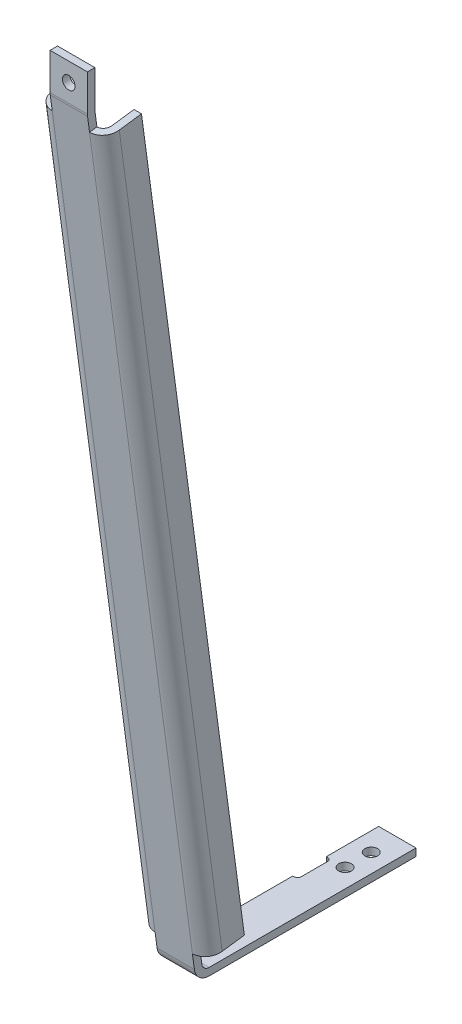
ISO-10303-21;
HEADER;
FILE_DESCRIPTION(('STEP AP214'),'2;1');
FILE_NAME('part.step','',(''),(''),'','','');
FILE_SCHEMA(('AUTOMOTIVE_DESIGN { 1 0 10303 214 1 1 1 1 }'));
ENDSEC;
DATA;
#1=APPLICATION_CONTEXT('core data for automotive mechanical design processes');
#2=APPLICATION_PROTOCOL_DEFINITION('international standard','automotive_design',2000,#1);
#3=PRODUCT_CONTEXT('',#1,'mechanical');
#4=PRODUCT('Part','Part','',(#3));
#5=PRODUCT_RELATED_PRODUCT_CATEGORY('part','',(#4));
#6=PRODUCT_DEFINITION_FORMATION('','',#4);
#7=PRODUCT_DEFINITION_CONTEXT('part definition',#1,'design');
#8=PRODUCT_DEFINITION('design','',#6,#7);
#9=PRODUCT_DEFINITION_SHAPE('','',#8);
#10=(LENGTH_UNIT() NAMED_UNIT(*) SI_UNIT(.MILLI.,.METRE.));
#11=(NAMED_UNIT(*) PLANE_ANGLE_UNIT() SI_UNIT($,.RADIAN.));
#12=(NAMED_UNIT(*) SI_UNIT($,.STERADIAN.) SOLID_ANGLE_UNIT());
#13=UNCERTAINTY_MEASURE_WITH_UNIT(LENGTH_MEASURE(1.E-05),#10,'distance_accuracy_value','');
#14=(GEOMETRIC_REPRESENTATION_CONTEXT(3) GLOBAL_UNCERTAINTY_ASSIGNED_CONTEXT((#13)) GLOBAL_UNIT_ASSIGNED_CONTEXT((#10,
#11,#12)) REPRESENTATION_CONTEXT('',''));
#15=CARTESIAN_POINT('',(0.,0.,0.));
#16=DIRECTION('',(0.,0.,1.));
#17=DIRECTION('',(1.,0.,0.));
#18=AXIS2_PLACEMENT_3D('',#15,#16,#17);
#19=CARTESIAN_POINT('',(-30.,68.,77.3774837469467));
#20=DIRECTION('',(1.,0.,0.));
#21=DIRECTION('',(0.,0.,-1.));
#22=AXIS2_PLACEMENT_3D('',#19,#20,#21);
#23=PLANE('',#22);
#24=DIRECTION('',(0.,0.,1.));
#25=VECTOR('',#24,1.);
#26=CARTESIAN_POINT('',(-30.,66.,77.3774837469467));
#27=LINE('',#26,#25);
#28=CARTESIAN_POINT('',(-30.,66.,45.));
#29=VERTEX_POINT('',#28);
#30=CARTESIAN_POINT('',(-30.,66.,77.3774837469467));
#31=VERTEX_POINT('',#30);
#32=EDGE_CURVE('E481',#29,#31,#27,.T.);
#33=ORIENTED_EDGE('',*,*,#32,.F.);
#34=DIRECTION('',(0.,-1.,0.));
#35=VECTOR('',#34,1.);
#36=CARTESIAN_POINT('',(-30.,68.,45.));
#37=LINE('',#36,#35);
#38=CARTESIAN_POINT('',(-30.,64.,45.));
#39=VERTEX_POINT('',#38);
#40=EDGE_CURVE('E244',#29,#39,#37,.T.);
#41=ORIENTED_EDGE('',*,*,#40,.T.);
#42=DIRECTION('',(0.,0.,-1.));
#43=VECTOR('',#42,1.);
#44=CARTESIAN_POINT('',(-30.,64.,22.));
#45=LINE('',#44,#43);
#46=CARTESIAN_POINT('',(-30.,64.,77.3774837469467));
#47=VERTEX_POINT('',#46);
#48=EDGE_CURVE('E265',#47,#39,#45,.T.);
#49=ORIENTED_EDGE('',*,*,#48,.F.);
#50=CARTESIAN_POINT('',(-30.,68.,77.3774837469467));
#51=DIRECTION('',(1.,0.,0.));
#52=DIRECTION('',(0.,0.,-1.));
#53=AXIS2_PLACEMENT_3D('',#50,#51,#52);
#54=CIRCLE('',#53,4.00000000000001);
#55=CARTESIAN_POINT('',(-30.,67.4653071902495,81.3415856123383));
#56=VERTEX_POINT('',#55);
#57=EDGE_CURVE('E263',#56,#47,#54,.T.);
#58=ORIENTED_EDGE('',*,*,#57,.F.);
#59=DIRECTION('',(0.,-0.991025466347899,-0.133673202437623));
#60=VECTOR('',#59,1.);
#61=CARTESIAN_POINT('',(-30.,67.4653071902495,81.3415856123383));
#62=LINE('',#61,#60);
#63=CARTESIAN_POINT('',(-30.,71.4294090556411,81.8762784220888));
#64=VERTEX_POINT('',#63);
#65=EDGE_CURVE('E496',#64,#56,#62,.T.);
#66=ORIENTED_EDGE('',*,*,#65,.F.);
#67=DIRECTION('',(0.,0.133673202437623,-0.991025466347899));
#68=VECTOR('',#67,1.);
#69=CARTESIAN_POINT('',(-30.,71.9641018653916,77.9121765566972));
#70=LINE('',#69,#68);
#71=CARTESIAN_POINT('',(-30.,71.6967554605163,79.894227489393));
#72=VERTEX_POINT('',#71);
#73=EDGE_CURVE('E308',#64,#72,#70,.T.);
#74=ORIENTED_EDGE('',*,*,#73,.T.);
#75=DIRECTION('',(0.,0.991025466347899,0.133673202437624));
#76=VECTOR('',#75,1.);
#77=CARTESIAN_POINT('',(-30.,279.934067195348,107.982050932696));
#78=LINE('',#77,#76);
#79=CARTESIAN_POINT('',(-30.,67.7326535951247,79.3595346796425));
#80=VERTEX_POINT('',#79);
#81=EDGE_CURVE('E490',#80,#72,#78,.T.);
#82=ORIENTED_EDGE('',*,*,#81,.F.);
#83=CARTESIAN_POINT('',(-30.,68.,77.3774837469467));
#84=DIRECTION('',(-1.,0.,0.));
#85=DIRECTION('',(0.,0.,-1.));
#86=AXIS2_PLACEMENT_3D('',#83,#84,#85);
#87=CIRCLE('',#86,2.);
#88=EDGE_CURVE('E482',#31,#80,#87,.T.);
#89=ORIENTED_EDGE('',*,*,#88,.F.);
#90=EDGE_LOOP('',(#33,#41,#49,#58,#66,#74,#82,#89));
#91=FACE_BOUND('',#90,.T.);
#92=ADVANCED_FACE('F41',(#91),#23,.F.);
#93=CARTESIAN_POINT('',(-20.,68.,77.3774837469467));
#94=DIRECTION('',(1.,0.,0.));
#95=DIRECTION('',(0.,0.,-1.));
#96=AXIS2_PLACEMENT_3D('',#93,#94,#95);
#97=PLANE('',#96);
#98=DIRECTION('',(0.,-0.991025466347899,-0.133673202437623));
#99=VECTOR('',#98,1.);
#100=CARTESIAN_POINT('',(-20.,67.4653071902495,81.3415856123383));
#101=LINE('',#100,#99);
#102=CARTESIAN_POINT('',(-20.,279.666720790473,109.964101865392));
#103=VERTEX_POINT('',#102);
#104=CARTESIAN_POINT('',(-20.,275.702618925081,109.429409055641));
#105=VERTEX_POINT('',#104);
#106=EDGE_CURVE('E475',#103,#105,#101,.T.);
#107=ORIENTED_EDGE('',*,*,#106,.T.);
#108=DIRECTION('',(0.,0.133673202437623,-0.991025466347899));
#109=VECTOR('',#108,1.);
#110=CARTESIAN_POINT('',(-20.,276.237311734832,105.465307190249));
#111=LINE('',#110,#109);
#112=CARTESIAN_POINT('',(-20.,275.969965329956,107.447358122945));
#113=VERTEX_POINT('',#112);
#114=EDGE_CURVE('E242',#105,#113,#111,.T.);
#115=ORIENTED_EDGE('',*,*,#114,.T.);
#116=DIRECTION('',(0.,0.991025466347899,0.133673202437624));
#117=VECTOR('',#116,1.);
#118=CARTESIAN_POINT('',(-20.,279.934067195348,107.982050932696));
#119=LINE('',#118,#117);
#120=CARTESIAN_POINT('',(-20.,279.934067195348,107.982050932696));
#121=VERTEX_POINT('',#120);
#122=EDGE_CURVE('E458',#113,#121,#119,.T.);
#123=ORIENTED_EDGE('',*,*,#122,.T.);
#124=CARTESIAN_POINT('',(-20.,280.201413600223,106.));
#125=DIRECTION('',(-1.,0.,0.));
#126=DIRECTION('',(0.,0.,-1.));
#127=AXIS2_PLACEMENT_3D('',#124,#125,#126);
#128=CIRCLE('',#127,2.00000000000001);
#129=CARTESIAN_POINT('',(-20.,280.201413600223,108.));
#130=VERTEX_POINT('',#129);
#131=EDGE_CURVE('E461',#121,#130,#128,.T.);
#132=ORIENTED_EDGE('',*,*,#131,.T.);
#133=DIRECTION('',(0.,1.,0.));
#134=VECTOR('',#133,1.);
#135=CARTESIAN_POINT('',(-20.,290.,108.));
#136=LINE('',#135,#134);
#137=CARTESIAN_POINT('',(-20.,290.,108.));
#138=VERTEX_POINT('',#137);
#139=EDGE_CURVE('E462',#130,#138,#136,.T.);
#140=ORIENTED_EDGE('',*,*,#139,.T.);
#141=DIRECTION('',(0.,0.,1.));
#142=VECTOR('',#141,1.);
#143=CARTESIAN_POINT('',(-20.,290.,110.));
#144=LINE('',#143,#142);
#145=CARTESIAN_POINT('',(-20.,290.,110.));
#146=VERTEX_POINT('',#145);
#147=EDGE_CURVE('E469',#138,#146,#144,.T.);
#148=ORIENTED_EDGE('',*,*,#147,.T.);
#149=DIRECTION('',(0.,-1.,0.));
#150=VECTOR('',#149,1.);
#151=CARTESIAN_POINT('',(-20.,280.201413600223,110.));
#152=LINE('',#151,#150);
#153=CARTESIAN_POINT('',(-20.,280.201413600223,110.));
#154=VERTEX_POINT('',#153);
#155=EDGE_CURVE('E466',#146,#154,#152,.T.);
#156=ORIENTED_EDGE('',*,*,#155,.T.);
#157=CARTESIAN_POINT('',(-20.,280.201413600223,106.));
#158=DIRECTION('',(1.,0.,0.));
#159=DIRECTION('',(0.,0.,-1.));
#160=AXIS2_PLACEMENT_3D('',#157,#158,#159);
#161=CIRCLE('',#160,3.99999999999999);
#162=EDGE_CURVE('E473',#154,#103,#161,.T.);
#163=ORIENTED_EDGE('',*,*,#162,.T.);
#164=EDGE_LOOP('',(#107,#115,#123,#132,#140,#148,#156,#163));
#165=FACE_BOUND('',#164,.T.);
#166=ADVANCED_FACE('F537',(#165),#97,.T.);
#167=DIRECTION('',(0.,0.133673202437623,-0.991025466347899));
#168=VECTOR('',#167,1.);
#169=CARTESIAN_POINT('',(-30.,276.237311734832,105.465307190249));
#170=LINE('',#169,#168);
#171=CARTESIAN_POINT('',(-30.,275.702618925081,109.429409055641));
#172=VERTEX_POINT('',#171);
#173=CARTESIAN_POINT('',(-30.,275.969965329956,107.447358122945));
#174=VERTEX_POINT('',#173);
#175=EDGE_CURVE('E310',#172,#174,#170,.T.);
#176=ORIENTED_EDGE('',*,*,#175,.F.);
#177=CARTESIAN_POINT('',(-30.,279.666720790473,109.964101865392));
#178=VERTEX_POINT('',#177);
#179=EDGE_CURVE('E266',#178,#172,#62,.T.);
#180=ORIENTED_EDGE('',*,*,#179,.F.);
#181=CARTESIAN_POINT('',(-30.,280.201413600223,106.));
#182=DIRECTION('',(1.,0.,0.));
#183=DIRECTION('',(0.,0.,-1.));
#184=AXIS2_PLACEMENT_3D('',#181,#182,#183);
#185=CIRCLE('',#184,3.99999999999999);
#186=CARTESIAN_POINT('',(-30.,280.201413600223,110.));
#187=VERTEX_POINT('',#186);
#188=EDGE_CURVE('E499',#187,#178,#185,.T.);
#189=ORIENTED_EDGE('',*,*,#188,.F.);
#190=DIRECTION('',(0.,-1.,0.));
#191=VECTOR('',#190,1.);
#192=CARTESIAN_POINT('',(-30.,280.201413600223,110.));
#193=LINE('',#192,#191);
#194=CARTESIAN_POINT('',(-30.,290.,110.));
#195=VERTEX_POINT('',#194);
#196=EDGE_CURVE('E497',#195,#187,#193,.T.);
#197=ORIENTED_EDGE('',*,*,#196,.F.);
#198=DIRECTION('',(0.,0.,1.));
#199=VECTOR('',#198,1.);
#200=CARTESIAN_POINT('',(-30.,290.,110.));
#201=LINE('',#200,#199);
#202=CARTESIAN_POINT('',(-30.,290.,108.));
#203=VERTEX_POINT('',#202);
#204=EDGE_CURVE('E493',#203,#195,#201,.T.);
#205=ORIENTED_EDGE('',*,*,#204,.F.);
#206=DIRECTION('',(0.,1.,0.));
#207=VECTOR('',#206,1.);
#208=CARTESIAN_POINT('',(-30.,290.,108.));
#209=LINE('',#208,#207);
#210=CARTESIAN_POINT('',(-30.,280.201413600223,108.));
#211=VERTEX_POINT('',#210);
#212=EDGE_CURVE('E495',#211,#203,#209,.T.);
#213=ORIENTED_EDGE('',*,*,#212,.F.);
#214=CARTESIAN_POINT('',(-30.,280.201413600223,106.));
#215=DIRECTION('',(-1.,0.,0.));
#216=DIRECTION('',(0.,0.,-1.));
#217=AXIS2_PLACEMENT_3D('',#214,#215,#216);
#218=CIRCLE('',#217,2.00000000000001);
#219=CARTESIAN_POINT('',(-30.,279.934067195348,107.982050932696));
#220=VERTEX_POINT('',#219);
#221=EDGE_CURVE('E489',#220,#211,#218,.T.);
#222=ORIENTED_EDGE('',*,*,#221,.F.);
#223=EDGE_CURVE('E486',#174,#220,#78,.T.);
#224=ORIENTED_EDGE('',*,*,#223,.F.);
#225=EDGE_LOOP('',(#176,#180,#189,#197,#205,#213,#222,#224));
#226=FACE_BOUND('',#225,.T.);
#227=ADVANCED_FACE('F565',(#226),#23,.F.);
#228=CARTESIAN_POINT('',(-20.,66.,22.));
#229=DIRECTION('',(0.,0.,1.));
#230=DIRECTION('',(1.,0.,0.));
#231=AXIS2_PLACEMENT_3D('',#228,#229,#230);
#232=PLANE('',#231);
#233=DIRECTION('',(0.,1.,0.));
#234=VECTOR('',#233,1.);
#235=CARTESIAN_POINT('',(-30.,66.,22.));
#236=LINE('',#235,#234);
#237=CARTESIAN_POINT('',(-30.,64.,22.));
#238=VERTEX_POINT('',#237);
#239=CARTESIAN_POINT('',(-30.,66.,22.));
#240=VERTEX_POINT('',#239);
#241=EDGE_CURVE('E261',#238,#240,#236,.T.);
#242=ORIENTED_EDGE('',*,*,#241,.T.);
#243=DIRECTION('',(-1.,0.,0.));
#244=VECTOR('',#243,1.);
#245=CARTESIAN_POINT('',(-20.,66.,22.));
#246=LINE('',#245,#244);
#247=CARTESIAN_POINT('',(-20.,66.,22.));
#248=VERTEX_POINT('',#247);
#249=EDGE_CURVE('E305',#248,#240,#246,.T.);
#250=ORIENTED_EDGE('',*,*,#249,.F.);
#251=DIRECTION('',(0.,1.,0.));
#252=VECTOR('',#251,1.);
#253=CARTESIAN_POINT('',(-20.,66.,22.));
#254=LINE('',#253,#252);
#255=CARTESIAN_POINT('',(-20.,64.,22.));
#256=VERTEX_POINT('',#255);
#257=EDGE_CURVE('E264',#256,#248,#254,.T.);
#258=ORIENTED_EDGE('',*,*,#257,.F.);
#259=DIRECTION('',(-1.,0.,0.));
#260=VECTOR('',#259,1.);
#261=CARTESIAN_POINT('',(-20.,64.,22.));
#262=LINE('',#261,#260);
#263=EDGE_CURVE('E269',#256,#238,#262,.T.);
#264=ORIENTED_EDGE('',*,*,#263,.T.);
#265=EDGE_LOOP('',(#242,#250,#258,#264));
#266=FACE_BOUND('',#265,.T.);
#267=ADVANCED_FACE('F43',(#266),#232,.F.);
#268=CARTESIAN_POINT('',(-20.,66.,77.3774837469467));
#269=DIRECTION('',(0.,-1.,0.));
#270=DIRECTION('',(0.,0.,-1.));
#271=AXIS2_PLACEMENT_3D('',#268,#269,#270);
#272=PLANE('',#271);
#273=CARTESIAN_POINT('',(-25.,66.,29.));
#274=DIRECTION('',(0.,-1.,0.));
#275=DIRECTION('',(0.,0.,-1.));
#276=AXIS2_PLACEMENT_3D('',#273,#274,#275);
#277=CIRCLE('',#276,1.7);
#278=CARTESIAN_POINT('',(-25.,66.,27.3));
#279=VERTEX_POINT('',#278);
#280=EDGE_CURVE('E321',#279,#279,#277,.T.);
#281=ORIENTED_EDGE('',*,*,#280,.T.);
#282=EDGE_LOOP('',(#281));
#283=FACE_BOUND('',#282,.T.);
#284=CARTESIAN_POINT('',(-25.,66.,36.));
#285=DIRECTION('',(0.,-1.,0.));
#286=DIRECTION('',(0.,0.,-1.));
#287=AXIS2_PLACEMENT_3D('',#284,#285,#286);
#288=CIRCLE('',#287,1.7);
#289=CARTESIAN_POINT('',(-25.,66.,34.3));
#290=VERTEX_POINT('',#289);
#291=EDGE_CURVE('E316',#290,#290,#288,.T.);
#292=ORIENTED_EDGE('',*,*,#291,.T.);
#293=EDGE_LOOP('',(#292));
#294=FACE_BOUND('',#293,.T.);
#295=CARTESIAN_POINT('',(-29.7,66.,44.));
#296=DIRECTION('',(0.,-1.,0.));
#297=DIRECTION('',(0.,0.,-1.));
#298=AXIS2_PLACEMENT_3D('',#295,#296,#297);
#299=CIRCLE('',#298,1.);
#300=CARTESIAN_POINT('',(-28.7,66.,44.));
#301=VERTEX_POINT('',#300);
#302=CARTESIAN_POINT('',(-29.7,66.,45.));
#303=VERTEX_POINT('',#302);
#304=EDGE_CURVE('E322',#301,#303,#299,.T.);
#305=ORIENTED_EDGE('',*,*,#304,.T.);
#306=DIRECTION('',(-1.,0.,0.));
#307=VECTOR('',#306,1.);
#308=CARTESIAN_POINT('',(-20.,66.,45.));
#309=LINE('',#308,#307);
#310=EDGE_CURVE('E355',#303,#29,#309,.T.);
#311=ORIENTED_EDGE('',*,*,#310,.T.);
#312=ORIENTED_EDGE('',*,*,#32,.T.);
#313=DIRECTION('',(-1.,0.,0.));
#314=VECTOR('',#313,1.);
#315=CARTESIAN_POINT('',(-20.,66.,77.3774837469467));
#316=LINE('',#315,#314);
#317=CARTESIAN_POINT('',(-20.,66.,77.3774837469467));
#318=VERTEX_POINT('',#317);
#319=EDGE_CURVE('E297',#318,#31,#316,.T.);
#320=ORIENTED_EDGE('',*,*,#319,.F.);
#321=DIRECTION('',(0.,0.,1.));
#322=VECTOR('',#321,1.);
#323=CARTESIAN_POINT('',(-20.,66.,77.3774837469467));
#324=LINE('',#323,#322);
#325=EDGE_CURVE('E457',#248,#318,#324,.T.);
#326=ORIENTED_EDGE('',*,*,#325,.F.);
#327=ORIENTED_EDGE('',*,*,#249,.T.);
#328=CARTESIAN_POINT('',(-30.,66.,36.));
#329=VERTEX_POINT('',#328);
#330=EDGE_CURVE('E485',#240,#329,#27,.T.);
#331=ORIENTED_EDGE('',*,*,#330,.T.);
#332=DIRECTION('',(1.,0.,0.));
#333=VECTOR('',#332,1.);
#334=CARTESIAN_POINT('',(-20.,66.,36.));
#335=LINE('',#334,#333);
#336=CARTESIAN_POINT('',(-29.7,66.,36.));
#337=VERTEX_POINT('',#336);
#338=EDGE_CURVE('E57',#329,#337,#335,.T.);
#339=ORIENTED_EDGE('',*,*,#338,.T.);
#340=CARTESIAN_POINT('',(-29.7,66.,37.));
#341=DIRECTION('',(0.,-1.,0.));
#342=DIRECTION('',(0.,0.,-1.));
#343=AXIS2_PLACEMENT_3D('',#340,#341,#342);
#344=CIRCLE('',#343,0.999999999999997);
#345=CARTESIAN_POINT('',(-28.7,66.,37.));
#346=VERTEX_POINT('',#345);
#347=EDGE_CURVE('E352',#337,#346,#344,.T.);
#348=ORIENTED_EDGE('',*,*,#347,.T.);
#349=DIRECTION('',(0.,0.,1.));
#350=VECTOR('',#349,1.);
#351=CARTESIAN_POINT('',(-28.7,66.,77.3774837469467));
#352=LINE('',#351,#350);
#353=EDGE_CURVE('E360',#346,#301,#352,.T.);
#354=ORIENTED_EDGE('',*,*,#353,.T.);
#355=EDGE_LOOP('',(#305,#311,#312,#320,#326,#327,#331,#339,#348,#354));
#356=FACE_BOUND('',#355,.T.);
#357=ADVANCED_FACE('F716',(#283,#294,#356),#272,.F.);
#358=CARTESIAN_POINT('',(-20.,68.,77.3774837469467));
#359=DIRECTION('',(-1.,0.,0.));
#360=DIRECTION('',(0.,0.,1.));
#361=AXIS2_PLACEMENT_3D('',#358,#359,#360);
#362=CYLINDRICAL_SURFACE('',#361,2.);
#363=ORIENTED_EDGE('',*,*,#88,.T.);
#364=DIRECTION('',(-1.,0.,0.));
#365=VECTOR('',#364,1.);
#366=CARTESIAN_POINT('',(-20.,67.7326535951247,79.3595346796425));
#367=LINE('',#366,#365);
#368=CARTESIAN_POINT('',(-20.,67.7326535951247,79.3595346796425));
#369=VERTEX_POINT('',#368);
#370=EDGE_CURVE('E300',#369,#80,#367,.T.);
#371=ORIENTED_EDGE('',*,*,#370,.F.);
#372=CARTESIAN_POINT('',(-20.,68.,77.3774837469467));
#373=DIRECTION('',(-1.,0.,0.));
#374=DIRECTION('',(0.,0.,-1.));
#375=AXIS2_PLACEMENT_3D('',#372,#373,#374);
#376=CIRCLE('',#375,2.);
#377=EDGE_CURVE('E456',#318,#369,#376,.T.);
#378=ORIENTED_EDGE('',*,*,#377,.F.);
#379=ORIENTED_EDGE('',*,*,#319,.T.);
#380=EDGE_LOOP('',(#363,#371,#378,#379));
#381=FACE_BOUND('',#380,.T.);
#382=ADVANCED_FACE('F727',(#381),#362,.F.);
#383=CARTESIAN_POINT('',(-20.,279.934067195348,107.982050932696));
#384=DIRECTION('',(0.,-0.133673202437624,0.991025466347899));
#385=DIRECTION('',(0.,-0.991025466347899,-0.133673202437624));
#386=AXIS2_PLACEMENT_3D('',#383,#384,#385);
#387=PLANE('',#386);
#388=ORIENTED_EDGE('',*,*,#122,.F.);
#389=DIRECTION('',(0.,-0.991025466347899,-0.133673202437623));
#390=VECTOR('',#389,1.);
#391=CARTESIAN_POINT('',(-20.,275.969965329956,107.447358122945));
#392=LINE('',#391,#390);
#393=CARTESIAN_POINT('',(-20.,71.6967554605164,79.894227489393));
#394=VERTEX_POINT('',#393);
#395=EDGE_CURVE('E418',#113,#394,#392,.T.);
#396=ORIENTED_EDGE('',*,*,#395,.T.);
#397=EDGE_CURVE('E463',#369,#394,#119,.T.);
#398=ORIENTED_EDGE('',*,*,#397,.F.);
#399=ORIENTED_EDGE('',*,*,#370,.T.);
#400=ORIENTED_EDGE('',*,*,#81,.T.);
#401=DIRECTION('',(0.,-0.991025466347899,-0.133673202437623));
#402=VECTOR('',#401,1.);
#403=CARTESIAN_POINT('',(-30.,275.969965329956,107.447358122945));
#404=LINE('',#403,#402);
#405=EDGE_CURVE('E405',#174,#72,#404,.T.);
#406=ORIENTED_EDGE('',*,*,#405,.F.);
#407=ORIENTED_EDGE('',*,*,#223,.T.);
#408=DIRECTION('',(-1.,0.,0.));
#409=VECTOR('',#408,1.);
#410=CARTESIAN_POINT('',(-20.,279.934067195348,107.982050932696));
#411=LINE('',#410,#409);
#412=EDGE_CURVE('E294',#121,#220,#411,.T.);
#413=ORIENTED_EDGE('',*,*,#412,.F.);
#414=EDGE_LOOP('',(#388,#396,#398,#399,#400,#406,#407,#413));
#415=FACE_BOUND('',#414,.T.);
#416=ADVANCED_FACE('F543',(#415),#387,.F.);
#417=CARTESIAN_POINT('',(-20.,280.201413600223,106.));
#418=DIRECTION('',(-1.,0.,0.));
#419=DIRECTION('',(0.,0.,1.));
#420=AXIS2_PLACEMENT_3D('',#417,#418,#419);
#421=CYLINDRICAL_SURFACE('',#420,2.00000000000001);
#422=ORIENTED_EDGE('',*,*,#221,.T.);
#423=DIRECTION('',(-1.,0.,0.));
#424=VECTOR('',#423,1.);
#425=CARTESIAN_POINT('',(-20.,280.201413600223,108.));
#426=LINE('',#425,#424);
#427=EDGE_CURVE('E292',#130,#211,#426,.T.);
#428=ORIENTED_EDGE('',*,*,#427,.F.);
#429=ORIENTED_EDGE('',*,*,#131,.F.);
#430=ORIENTED_EDGE('',*,*,#412,.T.);
#431=EDGE_LOOP('',(#422,#428,#429,#430));
#432=FACE_BOUND('',#431,.T.);
#433=ADVANCED_FACE('F738',(#432),#421,.F.);
#434=CARTESIAN_POINT('',(-20.,290.,108.));
#435=DIRECTION('',(0.,0.,1.));
#436=DIRECTION('',(1.,0.,0.));
#437=AXIS2_PLACEMENT_3D('',#434,#435,#436);
#438=PLANE('',#437);
#439=CARTESIAN_POINT('',(-25.,285.,108.));
#440=DIRECTION('',(0.,0.,1.));
#441=DIRECTION('',(1.,0.,0.));
#442=AXIS2_PLACEMENT_3D('',#439,#440,#441);
#443=CIRCLE('',#442,1.7);
#444=CARTESIAN_POINT('',(-23.3,285.,108.));
#445=VERTEX_POINT('',#444);
#446=EDGE_CURVE('E320',#445,#445,#443,.F.);
#447=ORIENTED_EDGE('',*,*,#446,.F.);
#448=EDGE_LOOP('',(#447));
#449=FACE_BOUND('',#448,.T.);
#450=ORIENTED_EDGE('',*,*,#212,.T.);
#451=DIRECTION('',(-1.,0.,0.));
#452=VECTOR('',#451,1.);
#453=CARTESIAN_POINT('',(-20.,290.,108.));
#454=LINE('',#453,#452);
#455=EDGE_CURVE('E290',#138,#203,#454,.T.);
#456=ORIENTED_EDGE('',*,*,#455,.F.);
#457=ORIENTED_EDGE('',*,*,#139,.F.);
#458=ORIENTED_EDGE('',*,*,#427,.T.);
#459=EDGE_LOOP('',(#450,#456,#457,#458));
#460=FACE_BOUND('',#459,.T.);
#461=ADVANCED_FACE('F739',(#449,#460),#438,.F.);
#462=CARTESIAN_POINT('',(-20.,290.,110.));
#463=DIRECTION('',(0.,-1.,0.));
#464=DIRECTION('',(0.,0.,-1.));
#465=AXIS2_PLACEMENT_3D('',#462,#463,#464);
#466=PLANE('',#465);
#467=ORIENTED_EDGE('',*,*,#204,.T.);
#468=DIRECTION('',(-1.,0.,0.));
#469=VECTOR('',#468,1.);
#470=CARTESIAN_POINT('',(-20.,290.,110.));
#471=LINE('',#470,#469);
#472=EDGE_CURVE('E282',#146,#195,#471,.T.);
#473=ORIENTED_EDGE('',*,*,#472,.F.);
#474=ORIENTED_EDGE('',*,*,#147,.F.);
#475=ORIENTED_EDGE('',*,*,#455,.T.);
#476=EDGE_LOOP('',(#467,#473,#474,#475));
#477=FACE_BOUND('',#476,.T.);
#478=ADVANCED_FACE('F744',(#477),#466,.F.);
#479=CARTESIAN_POINT('',(-20.,280.201413600223,110.));
#480=DIRECTION('',(0.,0.,-1.));
#481=DIRECTION('',(0.,1.,0.));
#482=AXIS2_PLACEMENT_3D('',#479,#480,#481);
#483=PLANE('',#482);
#484=CARTESIAN_POINT('',(-25.,285.,110.));
#485=DIRECTION('',(0.,0.,-1.));
#486=DIRECTION('',(0.,1.,0.));
#487=AXIS2_PLACEMENT_3D('',#484,#485,#486);
#488=CIRCLE('',#487,1.7);
#489=CARTESIAN_POINT('',(-25.,286.7,110.));
#490=VERTEX_POINT('',#489);
#491=EDGE_CURVE('E325',#490,#490,#488,.F.);
#492=ORIENTED_EDGE('',*,*,#491,.F.);
#493=EDGE_LOOP('',(#492));
#494=FACE_BOUND('',#493,.T.);
#495=ORIENTED_EDGE('',*,*,#196,.T.);
#496=DIRECTION('',(-1.,0.,0.));
#497=VECTOR('',#496,1.);
#498=CARTESIAN_POINT('',(-20.,280.201413600223,110.));
#499=LINE('',#498,#497);
#500=EDGE_CURVE('E285',#154,#187,#499,.T.);
#501=ORIENTED_EDGE('',*,*,#500,.F.);
#502=ORIENTED_EDGE('',*,*,#155,.F.);
#503=ORIENTED_EDGE('',*,*,#472,.T.);
#504=EDGE_LOOP('',(#495,#501,#502,#503));
#505=FACE_BOUND('',#504,.T.);
#506=ADVANCED_FACE('F748',(#494,#505),#483,.F.);
#507=CARTESIAN_POINT('',(-20.,280.201413600223,106.));
#508=DIRECTION('',(-1.,0.,0.));
#509=DIRECTION('',(0.,0.,1.));
#510=AXIS2_PLACEMENT_3D('',#507,#508,#509);
#511=CYLINDRICAL_SURFACE('',#510,3.99999999999999);
#512=ORIENTED_EDGE('',*,*,#188,.T.);
#513=DIRECTION('',(-1.,0.,0.));
#514=VECTOR('',#513,1.);
#515=CARTESIAN_POINT('',(-20.,279.666720790473,109.964101865392));
#516=LINE('',#515,#514);
#517=EDGE_CURVE('E276',#103,#178,#516,.T.);
#518=ORIENTED_EDGE('',*,*,#517,.F.);
#519=ORIENTED_EDGE('',*,*,#162,.F.);
#520=ORIENTED_EDGE('',*,*,#500,.T.);
#521=EDGE_LOOP('',(#512,#518,#519,#520));
#522=FACE_BOUND('',#521,.T.);
#523=ADVANCED_FACE('F750',(#522),#511,.T.);
#524=CARTESIAN_POINT('',(-20.,67.4653071902495,81.3415856123383));
#525=DIRECTION('',(0.,0.133673202437623,-0.991025466347899));
#526=DIRECTION('',(0.,0.991025466347899,0.133673202437623));
#527=AXIS2_PLACEMENT_3D('',#524,#525,#526);
#528=PLANE('',#527);
#529=DIRECTION('',(0.,-0.991025466347899,-0.133673202437623));
#530=VECTOR('',#529,1.);
#531=CARTESIAN_POINT('',(-30.,275.702618925081,109.429409055641));
#532=LINE('',#531,#530);
#533=EDGE_CURVE('E396',#172,#64,#532,.T.);
#534=ORIENTED_EDGE('',*,*,#533,.T.);
#535=ORIENTED_EDGE('',*,*,#65,.T.);
#536=DIRECTION('',(-1.,0.,0.));
#537=VECTOR('',#536,1.);
#538=CARTESIAN_POINT('',(-20.,67.4653071902495,81.3415856123383));
#539=LINE('',#538,#537);
#540=CARTESIAN_POINT('',(-20.,67.4653071902495,81.3415856123383));
#541=VERTEX_POINT('',#540);
#542=EDGE_CURVE('E277',#541,#56,#539,.T.);
#543=ORIENTED_EDGE('',*,*,#542,.F.);
#544=CARTESIAN_POINT('',(-20.,71.4294090556411,81.8762784220888));
#545=VERTEX_POINT('',#544);
#546=EDGE_CURVE('E471',#545,#541,#101,.T.);
#547=ORIENTED_EDGE('',*,*,#546,.F.);
#548=DIRECTION('',(0.,-0.991025466347899,-0.133673202437623));
#549=VECTOR('',#548,1.);
#550=CARTESIAN_POINT('',(-20.,275.702618925081,109.429409055641));
#551=LINE('',#550,#549);
#552=EDGE_CURVE('E414',#105,#545,#551,.T.);
#553=ORIENTED_EDGE('',*,*,#552,.F.);
#554=ORIENTED_EDGE('',*,*,#106,.F.);
#555=ORIENTED_EDGE('',*,*,#517,.T.);
#556=ORIENTED_EDGE('',*,*,#179,.T.);
#557=EDGE_LOOP('',(#534,#535,#543,#547,#553,#554,#555,#556));
#558=FACE_BOUND('',#557,.T.);
#559=ADVANCED_FACE('F502',(#558),#528,.F.);
#560=CARTESIAN_POINT('',(-20.,68.,77.3774837469467));
#561=DIRECTION('',(-1.,0.,0.));
#562=DIRECTION('',(0.,0.,1.));
#563=AXIS2_PLACEMENT_3D('',#560,#561,#562);
#564=CYLINDRICAL_SURFACE('',#563,4.00000000000001);
#565=ORIENTED_EDGE('',*,*,#57,.T.);
#566=DIRECTION('',(-1.,0.,0.));
#567=VECTOR('',#566,1.);
#568=CARTESIAN_POINT('',(-20.,64.,77.3774837469467));
#569=LINE('',#568,#567);
#570=CARTESIAN_POINT('',(-20.,64.,77.3774837469467));
#571=VERTEX_POINT('',#570);
#572=EDGE_CURVE('E275',#571,#47,#569,.T.);
#573=ORIENTED_EDGE('',*,*,#572,.F.);
#574=CARTESIAN_POINT('',(-20.,68.,77.3774837469467));
#575=DIRECTION('',(1.,0.,0.));
#576=DIRECTION('',(0.,0.,-1.));
#577=AXIS2_PLACEMENT_3D('',#574,#575,#576);
#578=CIRCLE('',#577,4.00000000000001);
#579=EDGE_CURVE('E480',#541,#571,#578,.T.);
#580=ORIENTED_EDGE('',*,*,#579,.F.);
#581=ORIENTED_EDGE('',*,*,#542,.T.);
#582=EDGE_LOOP('',(#565,#573,#580,#581));
#583=FACE_BOUND('',#582,.T.);
#584=ADVANCED_FACE('F508',(#583),#564,.T.);
#585=CARTESIAN_POINT('',(-20.,64.,22.));
#586=DIRECTION('',(0.,1.,0.));
#587=DIRECTION('',(0.,0.,1.));
#588=AXIS2_PLACEMENT_3D('',#585,#586,#587);
#589=PLANE('',#588);
#590=CARTESIAN_POINT('',(-25.,64.,29.));
#591=DIRECTION('',(0.,1.,0.));
#592=DIRECTION('',(0.,0.,1.));
#593=AXIS2_PLACEMENT_3D('',#590,#591,#592);
#594=CIRCLE('',#593,1.7);
#595=CARTESIAN_POINT('',(-25.,64.,30.7));
#596=VERTEX_POINT('',#595);
#597=EDGE_CURVE('E318',#596,#596,#594,.T.);
#598=ORIENTED_EDGE('',*,*,#597,.T.);
#599=EDGE_LOOP('',(#598));
#600=FACE_BOUND('',#599,.T.);
#601=CARTESIAN_POINT('',(-25.,64.,36.));
#602=DIRECTION('',(0.,1.,0.));
#603=DIRECTION('',(0.,0.,1.));
#604=AXIS2_PLACEMENT_3D('',#601,#602,#603);
#605=CIRCLE('',#604,1.7);
#606=CARTESIAN_POINT('',(-25.,64.,37.7));
#607=VERTEX_POINT('',#606);
#608=EDGE_CURVE('E311',#607,#607,#605,.T.);
#609=ORIENTED_EDGE('',*,*,#608,.T.);
#610=EDGE_LOOP('',(#609));
#611=FACE_BOUND('',#610,.T.);
#612=ORIENTED_EDGE('',*,*,#48,.T.);
#613=DIRECTION('',(1.,0.,0.));
#614=VECTOR('',#613,1.);
#615=CARTESIAN_POINT('',(-20.,64.,45.));
#616=LINE('',#615,#614);
#617=CARTESIAN_POINT('',(-29.7,64.,45.));
#618=VERTEX_POINT('',#617);
#619=EDGE_CURVE('E348',#39,#618,#616,.T.);
#620=ORIENTED_EDGE('',*,*,#619,.T.);
#621=CARTESIAN_POINT('',(-29.7,64.,44.));
#622=DIRECTION('',(0.,1.,0.));
#623=DIRECTION('',(0.,0.,1.));
#624=AXIS2_PLACEMENT_3D('',#621,#622,#623);
#625=CIRCLE('',#624,1.);
#626=CARTESIAN_POINT('',(-28.7,64.,44.));
#627=VERTEX_POINT('',#626);
#628=EDGE_CURVE('E11',#618,#627,#625,.T.);
#629=ORIENTED_EDGE('',*,*,#628,.T.);
#630=DIRECTION('',(0.,0.,-1.));
#631=VECTOR('',#630,1.);
#632=CARTESIAN_POINT('',(-28.7,64.,22.));
#633=LINE('',#632,#631);
#634=CARTESIAN_POINT('',(-28.7,64.,37.));
#635=VERTEX_POINT('',#634);
#636=EDGE_CURVE('E47',#627,#635,#633,.T.);
#637=ORIENTED_EDGE('',*,*,#636,.T.);
#638=CARTESIAN_POINT('',(-29.7,64.,37.));
#639=DIRECTION('',(0.,1.,0.));
#640=DIRECTION('',(0.,0.,1.));
#641=AXIS2_PLACEMENT_3D('',#638,#639,#640);
#642=CIRCLE('',#641,0.999999999999997);
#643=CARTESIAN_POINT('',(-29.7,64.,36.));
#644=VERTEX_POINT('',#643);
#645=EDGE_CURVE('E254',#635,#644,#642,.T.);
#646=ORIENTED_EDGE('',*,*,#645,.T.);
#647=DIRECTION('',(-1.,0.,0.));
#648=VECTOR('',#647,1.);
#649=CARTESIAN_POINT('',(-20.,64.,36.));
#650=LINE('',#649,#648);
#651=CARTESIAN_POINT('',(-30.,64.,36.));
#652=VERTEX_POINT('',#651);
#653=EDGE_CURVE('E239',#644,#652,#650,.T.);
#654=ORIENTED_EDGE('',*,*,#653,.T.);
#655=EDGE_CURVE('E252',#652,#238,#45,.T.);
#656=ORIENTED_EDGE('',*,*,#655,.T.);
#657=ORIENTED_EDGE('',*,*,#263,.F.);
#658=DIRECTION('',(0.,0.,-1.));
#659=VECTOR('',#658,1.);
#660=CARTESIAN_POINT('',(-20.,64.,22.));
#661=LINE('',#660,#659);
#662=EDGE_CURVE('E272',#571,#256,#661,.T.);
#663=ORIENTED_EDGE('',*,*,#662,.F.);
#664=ORIENTED_EDGE('',*,*,#572,.T.);
#665=EDGE_LOOP('',(#612,#620,#629,#637,#646,#654,#656,#657,#663,#664));
#666=FACE_BOUND('',#665,.T.);
#667=ADVANCED_FACE('F248',(#600,#611,#666),#589,.F.);
#668=DIRECTION('',(0.,0.133673202437623,-0.991025466347899));
#669=VECTOR('',#668,1.);
#670=CARTESIAN_POINT('',(-20.,71.9641018653916,77.9121765566972));
#671=LINE('',#670,#669);
#672=EDGE_CURVE('E64',#545,#394,#671,.T.);
#673=ORIENTED_EDGE('',*,*,#672,.F.);
#674=ORIENTED_EDGE('',*,*,#546,.T.);
#675=ORIENTED_EDGE('',*,*,#579,.T.);
#676=ORIENTED_EDGE('',*,*,#662,.T.);
#677=ORIENTED_EDGE('',*,*,#257,.T.);
#678=ORIENTED_EDGE('',*,*,#325,.T.);
#679=ORIENTED_EDGE('',*,*,#377,.T.);
#680=ORIENTED_EDGE('',*,*,#397,.T.);
#681=EDGE_LOOP('',(#673,#674,#675,#676,#677,#678,#679,#680));
#682=FACE_BOUND('',#681,.T.);
#683=ADVANCED_FACE('F518',(#682),#97,.T.);
#684=ORIENTED_EDGE('',*,*,#655,.F.);
#685=DIRECTION('',(0.,1.,0.));
#686=VECTOR('',#685,1.);
#687=CARTESIAN_POINT('',(-30.,68.,36.));
#688=LINE('',#687,#686);
#689=EDGE_CURVE('E237',#652,#329,#688,.T.);
#690=ORIENTED_EDGE('',*,*,#689,.T.);
#691=ORIENTED_EDGE('',*,*,#330,.F.);
#692=ORIENTED_EDGE('',*,*,#241,.F.);
#693=EDGE_LOOP('',(#684,#690,#691,#692));
#694=FACE_BOUND('',#693,.T.);
#695=ADVANCED_FACE('F259',(#694),#23,.F.);
#696=CARTESIAN_POINT('',(-30.,276.237311734832,105.465307190249));
#697=DIRECTION('',(0.,-0.991025466347899,-0.133673202437623));
#698=DIRECTION('',(0.,0.133673202437623,-0.991025466347899));
#699=AXIS2_PLACEMENT_3D('',#696,#697,#698);
#700=PLANE('',#699);
#701=CARTESIAN_POINT('',(-30.,276.237311734832,105.465307190249));
#702=DIRECTION('',(0.,-0.991025466347899,-0.133673202437623));
#703=DIRECTION('',(0.,0.133673202437623,-0.991025466347899));
#704=AXIS2_PLACEMENT_3D('',#701,#702,#703);
#705=CIRCLE('',#704,4.00000000000001);
#706=CARTESIAN_POINT('',(-34.,276.237311734832,105.465307190249));
#707=VERTEX_POINT('',#706);
#708=EDGE_CURVE('E366',#172,#707,#705,.T.);
#709=ORIENTED_EDGE('',*,*,#708,.F.);
#710=ORIENTED_EDGE('',*,*,#175,.T.);
#711=CARTESIAN_POINT('',(-30.,276.237311734832,105.465307190249));
#712=DIRECTION('',(0.,0.991025466347899,0.133673202437623));
#713=DIRECTION('',(0.,0.133673202437623,-0.991025466347899));
#714=AXIS2_PLACEMENT_3D('',#711,#712,#713);
#715=CIRCLE('',#714,2.00000000000001);
#716=CARTESIAN_POINT('',(-32.,276.237311734832,105.465307190249));
#717=VERTEX_POINT('',#716);
#718=EDGE_CURVE('E381',#717,#174,#715,.T.);
#719=ORIENTED_EDGE('',*,*,#718,.F.);
#720=DIRECTION('',(0.,-0.133673202437623,0.991025466347899));
#721=VECTOR('',#720,1.);
#722=CARTESIAN_POINT('',(-32.,277.039350949457,99.519154392162));
#723=LINE('',#722,#721);
#724=CARTESIAN_POINT('',(-32.,277.039350949457,99.519154392162));
#725=VERTEX_POINT('',#724);
#726=EDGE_CURVE('E378',#725,#717,#723,.T.);
#727=ORIENTED_EDGE('',*,*,#726,.F.);
#728=DIRECTION('',(1.,0.,0.));
#729=VECTOR('',#728,1.);
#730=CARTESIAN_POINT('',(-34.,277.039350949457,99.519154392162));
#731=LINE('',#730,#729);
#732=CARTESIAN_POINT('',(-34.,277.039350949457,99.519154392162));
#733=VERTEX_POINT('',#732);
#734=EDGE_CURVE('E374',#733,#725,#731,.T.);
#735=ORIENTED_EDGE('',*,*,#734,.F.);
#736=DIRECTION('',(0.,0.133673202437623,-0.991025466347899));
#737=VECTOR('',#736,1.);
#738=CARTESIAN_POINT('',(-34.,276.237311734832,105.465307190249));
#739=LINE('',#738,#737);
#740=EDGE_CURVE('E371',#707,#733,#739,.T.);
#741=ORIENTED_EDGE('',*,*,#740,.F.);
#742=EDGE_LOOP('',(#709,#710,#719,#727,#735,#741));
#743=FACE_BOUND('',#742,.T.);
#744=ADVANCED_FACE('F574',(#743),#700,.F.);
#745=CARTESIAN_POINT('',(-30.,71.9641018653916,77.9121765566972));
#746=DIRECTION('',(0.,-0.991025466347899,-0.133673202437623));
#747=DIRECTION('',(0.,0.133673202437623,-0.991025466347899));
#748=AXIS2_PLACEMENT_3D('',#745,#746,#747);
#749=PLANE('',#748);
#750=ORIENTED_EDGE('',*,*,#73,.F.);
#751=CARTESIAN_POINT('',(-30.,71.9641018653916,77.9121765566972));
#752=DIRECTION('',(0.,-0.991025466347899,-0.133673202437623));
#753=DIRECTION('',(0.,0.133673202437623,-0.991025466347899));
#754=AXIS2_PLACEMENT_3D('',#751,#752,#753);
#755=CIRCLE('',#754,4.00000000000001);
#756=CARTESIAN_POINT('',(-34.,71.9641018653916,77.9121765566972));
#757=VERTEX_POINT('',#756);
#758=EDGE_CURVE('E384',#64,#757,#755,.T.);
#759=ORIENTED_EDGE('',*,*,#758,.T.);
#760=DIRECTION('',(0.,0.133673202437623,-0.991025466347899));
#761=VECTOR('',#760,1.);
#762=CARTESIAN_POINT('',(-34.,71.9641018653916,77.9121765566972));
#763=LINE('',#762,#761);
#764=CARTESIAN_POINT('',(-34.,72.7661410800173,71.9660237586098));
#765=VERTEX_POINT('',#764);
#766=EDGE_CURVE('E389',#757,#765,#763,.T.);
#767=ORIENTED_EDGE('',*,*,#766,.T.);
#768=DIRECTION('',(1.,0.,0.));
#769=VECTOR('',#768,1.);
#770=CARTESIAN_POINT('',(-34.,72.7661410800173,71.9660237586098));
#771=LINE('',#770,#769);
#772=CARTESIAN_POINT('',(-32.,72.7661410800173,71.9660237586098));
#773=VERTEX_POINT('',#772);
#774=EDGE_CURVE('E395',#765,#773,#771,.T.);
#775=ORIENTED_EDGE('',*,*,#774,.T.);
#776=DIRECTION('',(0.,-0.133673202437623,0.991025466347899));
#777=VECTOR('',#776,1.);
#778=CARTESIAN_POINT('',(-32.,72.7661410800173,71.9660237586098));
#779=LINE('',#778,#777);
#780=CARTESIAN_POINT('',(-32.,71.9641018653916,77.9121765566972));
#781=VERTEX_POINT('',#780);
#782=EDGE_CURVE('E392',#773,#781,#779,.T.);
#783=ORIENTED_EDGE('',*,*,#782,.T.);
#784=CARTESIAN_POINT('',(-30.,71.9641018653916,77.9121765566972));
#785=DIRECTION('',(0.,0.991025466347899,0.133673202437623));
#786=DIRECTION('',(0.,0.133673202437623,-0.991025466347899));
#787=AXIS2_PLACEMENT_3D('',#784,#785,#786);
#788=CIRCLE('',#787,2.00000000000001);
#789=EDGE_CURVE('E375',#781,#72,#788,.T.);
#790=ORIENTED_EDGE('',*,*,#789,.T.);
#791=EDGE_LOOP('',(#750,#759,#767,#775,#783,#790));
#792=FACE_BOUND('',#791,.T.);
#793=ADVANCED_FACE('F578',(#792),#749,.T.);
#794=CARTESIAN_POINT('',(-30.,276.237311734832,105.465307190249));
#795=DIRECTION('',(0.,-0.991025466347899,-0.133673202437623));
#796=DIRECTION('',(0.,0.133673202437623,-0.991025466347899));
#797=AXIS2_PLACEMENT_3D('',#794,#795,#796);
#798=CYLINDRICAL_SURFACE('',#797,4.00000000000001);
#799=ORIENTED_EDGE('',*,*,#758,.F.);
#800=ORIENTED_EDGE('',*,*,#533,.F.);
#801=ORIENTED_EDGE('',*,*,#708,.T.);
#802=DIRECTION('',(0.,-0.991025466347899,-0.133673202437623));
#803=VECTOR('',#802,1.);
#804=CARTESIAN_POINT('',(-34.,276.237311734832,105.465307190249));
#805=LINE('',#804,#803);
#806=EDGE_CURVE('E383',#707,#757,#805,.T.);
#807=ORIENTED_EDGE('',*,*,#806,.T.);
#808=EDGE_LOOP('',(#799,#800,#801,#807));
#809=FACE_BOUND('',#808,.T.);
#810=ADVANCED_FACE('F613',(#809),#798,.T.);
#811=CARTESIAN_POINT('',(-30.,276.237311734832,105.465307190249));
#812=DIRECTION('',(0.,-0.991025466347899,-0.133673202437623));
#813=DIRECTION('',(0.,0.133673202437623,-0.991025466347899));
#814=AXIS2_PLACEMENT_3D('',#811,#812,#813);
#815=CYLINDRICAL_SURFACE('',#814,2.00000000000001);
#816=ORIENTED_EDGE('',*,*,#789,.F.);
#817=DIRECTION('',(0.,-0.991025466347899,-0.133673202437623));
#818=VECTOR('',#817,1.);
#819=CARTESIAN_POINT('',(-32.,276.237311734832,105.465307190249));
#820=LINE('',#819,#818);
#821=EDGE_CURVE('E403',#717,#781,#820,.T.);
#822=ORIENTED_EDGE('',*,*,#821,.F.);
#823=ORIENTED_EDGE('',*,*,#718,.T.);
#824=ORIENTED_EDGE('',*,*,#405,.T.);
#825=EDGE_LOOP('',(#816,#822,#823,#824));
#826=FACE_BOUND('',#825,.T.);
#827=ADVANCED_FACE('F611',(#826),#815,.F.);
#828=CARTESIAN_POINT('',(-32.,277.039350949457,99.519154392162));
#829=DIRECTION('',(1.,0.,0.));
#830=DIRECTION('',(0.,0.,-1.));
#831=AXIS2_PLACEMENT_3D('',#828,#829,#830);
#832=PLANE('',#831);
#833=ORIENTED_EDGE('',*,*,#782,.F.);
#834=DIRECTION('',(0.,-0.991025466347899,-0.133673202437623));
#835=VECTOR('',#834,1.);
#836=CARTESIAN_POINT('',(-32.,277.039350949457,99.519154392162));
#837=LINE('',#836,#835);
#838=EDGE_CURVE('E410',#725,#773,#837,.T.);
#839=ORIENTED_EDGE('',*,*,#838,.F.);
#840=ORIENTED_EDGE('',*,*,#726,.T.);
#841=ORIENTED_EDGE('',*,*,#821,.T.);
#842=EDGE_LOOP('',(#833,#839,#840,#841));
#843=FACE_BOUND('',#842,.T.);
#844=ADVANCED_FACE('F617',(#843),#832,.T.);
#845=CARTESIAN_POINT('',(-34.,277.039350949457,99.519154392162));
#846=DIRECTION('',(0.,0.133673202437623,-0.991025466347899));
#847=DIRECTION('',(0.,0.991025466347899,0.133673202437623));
#848=AXIS2_PLACEMENT_3D('',#845,#846,#847);
#849=PLANE('',#848);
#850=ORIENTED_EDGE('',*,*,#774,.F.);
#851=DIRECTION('',(0.,-0.991025466347899,-0.133673202437623));
#852=VECTOR('',#851,1.);
#853=CARTESIAN_POINT('',(-34.,277.039350949457,99.519154392162));
#854=LINE('',#853,#852);
#855=EDGE_CURVE('E409',#733,#765,#854,.T.);
#856=ORIENTED_EDGE('',*,*,#855,.F.);
#857=ORIENTED_EDGE('',*,*,#734,.T.);
#858=ORIENTED_EDGE('',*,*,#838,.T.);
#859=EDGE_LOOP('',(#850,#856,#857,#858));
#860=FACE_BOUND('',#859,.T.);
#861=ADVANCED_FACE('F618',(#860),#849,.T.);
#862=CARTESIAN_POINT('',(-34.,276.237311734832,105.465307190249));
#863=DIRECTION('',(-1.,0.,0.));
#864=DIRECTION('',(0.,0.,1.));
#865=AXIS2_PLACEMENT_3D('',#862,#863,#864);
#866=PLANE('',#865);
#867=ORIENTED_EDGE('',*,*,#766,.F.);
#868=ORIENTED_EDGE('',*,*,#806,.F.);
#869=ORIENTED_EDGE('',*,*,#740,.T.);
#870=ORIENTED_EDGE('',*,*,#855,.T.);
#871=EDGE_LOOP('',(#867,#868,#869,#870));
#872=FACE_BOUND('',#871,.T.);
#873=ADVANCED_FACE('F624',(#872),#866,.T.);
#874=CARTESIAN_POINT('',(-20.,276.237311734832,105.465307190249));
#875=DIRECTION('',(0.,-0.991025466347899,-0.133673202437623));
#876=DIRECTION('',(0.,0.133673202437623,-0.991025466347899));
#877=AXIS2_PLACEMENT_3D('',#874,#875,#876);
#878=CYLINDRICAL_SURFACE('',#877,4.00000000000001);
#879=CARTESIAN_POINT('',(-20.,71.9641018653916,77.9121765566972));
#880=DIRECTION('',(0.,-0.991025466347899,-0.133673202437623));
#881=DIRECTION('',(0.,0.133673202437623,-0.991025466347899));
#882=AXIS2_PLACEMENT_3D('',#879,#880,#881);
#883=CIRCLE('',#882,4.00000000000001);
#884=CARTESIAN_POINT('',(-16.,71.9641018653916,77.9121765566972));
#885=VERTEX_POINT('',#884);
#886=EDGE_CURVE('E386',#885,#545,#883,.T.);
#887=ORIENTED_EDGE('',*,*,#886,.F.);
#888=DIRECTION('',(0.,-0.991025466347899,-0.133673202437623));
#889=VECTOR('',#888,1.);
#890=CARTESIAN_POINT('',(-16.,276.237311734832,105.465307190249));
#891=LINE('',#890,#889);
#892=CARTESIAN_POINT('',(-16.,276.237311734832,105.465307190249));
#893=VERTEX_POINT('',#892);
#894=EDGE_CURVE('E370',#893,#885,#891,.T.);
#895=ORIENTED_EDGE('',*,*,#894,.F.);
#896=CARTESIAN_POINT('',(-20.,276.237311734832,105.465307190249));
#897=DIRECTION('',(0.,-0.991025466347899,-0.133673202437623));
#898=DIRECTION('',(0.,0.133673202437623,-0.991025466347899));
#899=AXIS2_PLACEMENT_3D('',#896,#897,#898);
#900=CIRCLE('',#899,4.00000000000001);
#901=EDGE_CURVE('E429',#893,#105,#900,.T.);
#902=ORIENTED_EDGE('',*,*,#901,.T.);
#903=ORIENTED_EDGE('',*,*,#552,.T.);
#904=EDGE_LOOP('',(#887,#895,#902,#903));
#905=FACE_BOUND('',#904,.T.);
#906=ADVANCED_FACE('F522',(#905),#878,.T.);
#907=CARTESIAN_POINT('',(-16.,276.237311734832,105.465307190249));
#908=DIRECTION('',(1.,0.,0.));
#909=DIRECTION('',(0.,0.,-1.));
#910=AXIS2_PLACEMENT_3D('',#907,#908,#909);
#911=PLANE('',#910);
#912=DIRECTION('',(0.,-0.133673202437623,0.991025466347899));
#913=VECTOR('',#912,1.);
#914=CARTESIAN_POINT('',(-16.,71.9641018653916,77.9121765566972));
#915=LINE('',#914,#913);
#916=CARTESIAN_POINT('',(-16.,72.7661410800173,71.9660237586098));
#917=VERTEX_POINT('',#916);
#918=EDGE_CURVE('E426',#917,#885,#915,.T.);
#919=ORIENTED_EDGE('',*,*,#918,.F.);
#920=DIRECTION('',(0.,-0.991025466347899,-0.133673202437623));
#921=VECTOR('',#920,1.);
#922=CARTESIAN_POINT('',(-16.,277.039350949457,99.519154392162));
#923=LINE('',#922,#921);
#924=CARTESIAN_POINT('',(-16.,277.039350949457,99.519154392162));
#925=VERTEX_POINT('',#924);
#926=EDGE_CURVE('E421',#925,#917,#923,.T.);
#927=ORIENTED_EDGE('',*,*,#926,.F.);
#928=DIRECTION('',(0.,-0.133673202437623,0.991025466347899));
#929=VECTOR('',#928,1.);
#930=CARTESIAN_POINT('',(-16.,276.237311734832,105.465307190249));
#931=LINE('',#930,#929);
#932=EDGE_CURVE('E413',#925,#893,#931,.T.);
#933=ORIENTED_EDGE('',*,*,#932,.T.);
#934=ORIENTED_EDGE('',*,*,#894,.T.);
#935=EDGE_LOOP('',(#919,#927,#933,#934));
#936=FACE_BOUND('',#935,.T.);
#937=ADVANCED_FACE('F530',(#936),#911,.T.);
#938=CARTESIAN_POINT('',(-16.,277.039350949457,99.519154392162));
#939=DIRECTION('',(0.,0.133673202437623,-0.991025466347899));
#940=DIRECTION('',(0.,0.991025466347899,0.133673202437623));
#941=AXIS2_PLACEMENT_3D('',#938,#939,#940);
#942=PLANE('',#941);
#943=DIRECTION('',(1.,0.,0.));
#944=VECTOR('',#943,1.);
#945=CARTESIAN_POINT('',(-16.,72.7661410800173,71.9660237586098));
#946=LINE('',#945,#944);
#947=CARTESIAN_POINT('',(-18.,72.7661410800173,71.9660237586098));
#948=VERTEX_POINT('',#947);
#949=EDGE_CURVE('E427',#948,#917,#946,.T.);
#950=ORIENTED_EDGE('',*,*,#949,.F.);
#951=DIRECTION('',(0.,-0.991025466347899,-0.133673202437623));
#952=VECTOR('',#951,1.);
#953=CARTESIAN_POINT('',(-18.,277.039350949457,99.519154392162));
#954=LINE('',#953,#952);
#955=CARTESIAN_POINT('',(-18.,277.039350949457,99.519154392162));
#956=VERTEX_POINT('',#955);
#957=EDGE_CURVE('E423',#956,#948,#954,.T.);
#958=ORIENTED_EDGE('',*,*,#957,.F.);
#959=DIRECTION('',(1.,0.,0.));
#960=VECTOR('',#959,1.);
#961=CARTESIAN_POINT('',(-16.,277.039350949457,99.519154392162));
#962=LINE('',#961,#960);
#963=EDGE_CURVE('E444',#956,#925,#962,.T.);
#964=ORIENTED_EDGE('',*,*,#963,.T.);
#965=ORIENTED_EDGE('',*,*,#926,.T.);
#966=EDGE_LOOP('',(#950,#958,#964,#965));
#967=FACE_BOUND('',#966,.T.);
#968=ADVANCED_FACE('F555',(#967),#942,.T.);
#969=CARTESIAN_POINT('',(-18.,277.039350949457,99.519154392162));
#970=DIRECTION('',(-1.,0.,0.));
#971=DIRECTION('',(0.,0.,1.));
#972=AXIS2_PLACEMENT_3D('',#969,#970,#971);
#973=PLANE('',#972);
#974=DIRECTION('',(0.,0.133673202437623,-0.991025466347899));
#975=VECTOR('',#974,1.);
#976=CARTESIAN_POINT('',(-18.,72.7661410800173,71.9660237586098));
#977=LINE('',#976,#975);
#978=CARTESIAN_POINT('',(-18.,71.9641018653916,77.9121765566972));
#979=VERTEX_POINT('',#978);
#980=EDGE_CURVE('E433',#979,#948,#977,.T.);
#981=ORIENTED_EDGE('',*,*,#980,.F.);
#982=DIRECTION('',(0.,-0.991025466347899,-0.133673202437623));
#983=VECTOR('',#982,1.);
#984=CARTESIAN_POINT('',(-18.,276.237311734832,105.465307190249));
#985=LINE('',#984,#983);
#986=CARTESIAN_POINT('',(-18.,276.237311734832,105.465307190249));
#987=VERTEX_POINT('',#986);
#988=EDGE_CURVE('E420',#987,#979,#985,.T.);
#989=ORIENTED_EDGE('',*,*,#988,.F.);
#990=DIRECTION('',(0.,0.133673202437623,-0.991025466347899));
#991=VECTOR('',#990,1.);
#992=CARTESIAN_POINT('',(-18.,277.039350949457,99.519154392162));
#993=LINE('',#992,#991);
#994=EDGE_CURVE('E448',#987,#956,#993,.T.);
#995=ORIENTED_EDGE('',*,*,#994,.T.);
#996=ORIENTED_EDGE('',*,*,#957,.T.);
#997=EDGE_LOOP('',(#981,#989,#995,#996));
#998=FACE_BOUND('',#997,.T.);
#999=ADVANCED_FACE('F549',(#998),#973,.T.);
#1000=CARTESIAN_POINT('',(-20.,276.237311734832,105.465307190249));
#1001=DIRECTION('',(0.,-0.991025466347899,-0.133673202437623));
#1002=DIRECTION('',(0.,0.133673202437623,-0.991025466347899));
#1003=AXIS2_PLACEMENT_3D('',#1000,#1001,#1002);
#1004=CYLINDRICAL_SURFACE('',#1003,2.00000000000001);
#1005=CARTESIAN_POINT('',(-20.,71.9641018653916,77.9121765566972));
#1006=DIRECTION('',(0.,0.991025466347899,0.133673202437623));
#1007=DIRECTION('',(0.,0.133673202437623,-0.991025466347899));
#1008=AXIS2_PLACEMENT_3D('',#1005,#1006,#1007);
#1009=CIRCLE('',#1008,2.00000000000001);
#1010=EDGE_CURVE('E436',#394,#979,#1009,.T.);
#1011=ORIENTED_EDGE('',*,*,#1010,.F.);
#1012=ORIENTED_EDGE('',*,*,#395,.F.);
#1013=CARTESIAN_POINT('',(-20.,276.237311734832,105.465307190249));
#1014=DIRECTION('',(0.,0.991025466347899,0.133673202437623));
#1015=DIRECTION('',(0.,0.133673202437623,-0.991025466347899));
#1016=AXIS2_PLACEMENT_3D('',#1013,#1014,#1015);
#1017=CIRCLE('',#1016,2.00000000000001);
#1018=EDGE_CURVE('E449',#113,#987,#1017,.T.);
#1019=ORIENTED_EDGE('',*,*,#1018,.T.);
#1020=ORIENTED_EDGE('',*,*,#988,.T.);
#1021=EDGE_LOOP('',(#1011,#1012,#1019,#1020));
#1022=FACE_BOUND('',#1021,.T.);
#1023=ADVANCED_FACE('F550',(#1022),#1004,.F.);
#1024=CARTESIAN_POINT('',(-20.,276.237311734832,105.465307190249));
#1025=DIRECTION('',(0.,-0.991025466347899,-0.133673202437623));
#1026=DIRECTION('',(0.,0.133673202437623,-0.991025466347899));
#1027=AXIS2_PLACEMENT_3D('',#1024,#1025,#1026);
#1028=PLANE('',#1027);
#1029=ORIENTED_EDGE('',*,*,#114,.F.);
#1030=ORIENTED_EDGE('',*,*,#901,.F.);
#1031=ORIENTED_EDGE('',*,*,#932,.F.);
#1032=ORIENTED_EDGE('',*,*,#963,.F.);
#1033=ORIENTED_EDGE('',*,*,#994,.F.);
#1034=ORIENTED_EDGE('',*,*,#1018,.F.);
#1035=EDGE_LOOP('',(#1029,#1030,#1031,#1032,#1033,#1034));
#1036=FACE_BOUND('',#1035,.T.);
#1037=ADVANCED_FACE('F531',(#1036),#1028,.F.);
#1038=CARTESIAN_POINT('',(-20.,71.9641018653916,77.9121765566972));
#1039=DIRECTION('',(0.,-0.991025466347899,-0.133673202437623));
#1040=DIRECTION('',(0.,0.133673202437623,-0.991025466347899));
#1041=AXIS2_PLACEMENT_3D('',#1038,#1039,#1040);
#1042=PLANE('',#1041);
#1043=ORIENTED_EDGE('',*,*,#886,.T.);
#1044=ORIENTED_EDGE('',*,*,#672,.T.);
#1045=ORIENTED_EDGE('',*,*,#1010,.T.);
#1046=ORIENTED_EDGE('',*,*,#980,.T.);
#1047=ORIENTED_EDGE('',*,*,#949,.T.);
#1048=ORIENTED_EDGE('',*,*,#918,.T.);
#1049=EDGE_LOOP('',(#1043,#1044,#1045,#1046,#1047,#1048));
#1050=FACE_BOUND('',#1049,.T.);
#1051=ADVANCED_FACE('F521',(#1050),#1042,.T.);
#1052=CARTESIAN_POINT('',(-25.,66.2,36.));
#1053=DIRECTION('',(0.,-1.,0.));
#1054=DIRECTION('',(0.,0.,-1.));
#1055=AXIS2_PLACEMENT_3D('',#1052,#1053,#1054);
#1056=CYLINDRICAL_SURFACE('',#1055,1.7);
#1057=ORIENTED_EDGE('',*,*,#608,.F.);
#1058=EDGE_LOOP('',(#1057));
#1059=FACE_BOUND('',#1058,.T.);
#1060=ORIENTED_EDGE('',*,*,#291,.F.);
#1061=EDGE_LOOP('',(#1060));
#1062=FACE_BOUND('',#1061,.T.);
#1063=ADVANCED_FACE('F595',(#1059,#1062),#1056,.F.);
#1064=CARTESIAN_POINT('',(-25.,66.2,29.));
#1065=DIRECTION('',(0.,-1.,0.));
#1066=DIRECTION('',(0.,0.,-1.));
#1067=AXIS2_PLACEMENT_3D('',#1064,#1065,#1066);
#1068=CYLINDRICAL_SURFACE('',#1067,1.7);
#1069=ORIENTED_EDGE('',*,*,#597,.F.);
#1070=EDGE_LOOP('',(#1069));
#1071=FACE_BOUND('',#1070,.T.);
#1072=ORIENTED_EDGE('',*,*,#280,.F.);
#1073=EDGE_LOOP('',(#1072));
#1074=FACE_BOUND('',#1073,.T.);
#1075=ADVANCED_FACE('F596',(#1071,#1074),#1068,.F.);
#1076=CARTESIAN_POINT('',(-25.,285.,110.2));
#1077=DIRECTION('',(0.,0.,-1.));
#1078=DIRECTION('',(-1.,0.,0.));
#1079=AXIS2_PLACEMENT_3D('',#1076,#1077,#1078);
#1080=CYLINDRICAL_SURFACE('',#1079,1.7);
#1081=ORIENTED_EDGE('',*,*,#491,.T.);
#1082=EDGE_LOOP('',(#1081));
#1083=FACE_BOUND('',#1082,.T.);
#1084=ORIENTED_EDGE('',*,*,#446,.T.);
#1085=EDGE_LOOP('',(#1084));
#1086=FACE_BOUND('',#1085,.T.);
#1087=ADVANCED_FACE('F605',(#1083,#1086),#1080,.F.);
#1088=CARTESIAN_POINT('',(-29.7,66.2,44.));
#1089=DIRECTION('',(0.,-1.,0.));
#1090=DIRECTION('',(0.,0.,-1.));
#1091=AXIS2_PLACEMENT_3D('',#1088,#1089,#1090);
#1092=CYLINDRICAL_SURFACE('',#1091,1.);
#1093=DIRECTION('',(0.,-1.,0.));
#1094=VECTOR('',#1093,1.);
#1095=CARTESIAN_POINT('',(-28.7,66.2,44.));
#1096=LINE('',#1095,#1094);
#1097=EDGE_CURVE('E331',#301,#627,#1096,.T.);
#1098=ORIENTED_EDGE('',*,*,#1097,.T.);
#1099=ORIENTED_EDGE('',*,*,#628,.F.);
#1100=DIRECTION('',(0.,-1.,0.));
#1101=VECTOR('',#1100,1.);
#1102=CARTESIAN_POINT('',(-29.7,66.2,45.));
#1103=LINE('',#1102,#1101);
#1104=EDGE_CURVE('E258',#303,#618,#1103,.T.);
#1105=ORIENTED_EDGE('',*,*,#1104,.F.);
#1106=ORIENTED_EDGE('',*,*,#304,.F.);
#1107=EDGE_LOOP('',(#1098,#1099,#1105,#1106));
#1108=FACE_BOUND('',#1107,.T.);
#1109=ADVANCED_FACE('F339',(#1108),#1092,.F.);
#1110=CARTESIAN_POINT('',(-28.7,66.2,37.));
#1111=DIRECTION('',(1.,0.,0.));
#1112=DIRECTION('',(0.,0.,-1.));
#1113=AXIS2_PLACEMENT_3D('',#1110,#1111,#1112);
#1114=PLANE('',#1113);
#1115=DIRECTION('',(0.,-1.,0.));
#1116=VECTOR('',#1115,1.);
#1117=CARTESIAN_POINT('',(-28.7,66.2,37.));
#1118=LINE('',#1117,#1116);
#1119=EDGE_CURVE('E340',#346,#635,#1118,.T.);
#1120=ORIENTED_EDGE('',*,*,#1119,.T.);
#1121=ORIENTED_EDGE('',*,*,#636,.F.);
#1122=ORIENTED_EDGE('',*,*,#1097,.F.);
#1123=ORIENTED_EDGE('',*,*,#353,.F.);
#1124=EDGE_LOOP('',(#1120,#1121,#1122,#1123));
#1125=FACE_BOUND('',#1124,.T.);
#1126=ADVANCED_FACE('F334',(#1125),#1114,.F.);
#1127=CARTESIAN_POINT('',(-29.7,66.2,37.));
#1128=DIRECTION('',(0.,-1.,0.));
#1129=DIRECTION('',(0.,0.,-1.));
#1130=AXIS2_PLACEMENT_3D('',#1127,#1128,#1129);
#1131=CYLINDRICAL_SURFACE('',#1130,0.999999999999997);
#1132=DIRECTION('',(0.,-1.,0.));
#1133=VECTOR('',#1132,1.);
#1134=CARTESIAN_POINT('',(-29.7,66.2,36.));
#1135=LINE('',#1134,#1133);
#1136=EDGE_CURVE('E343',#337,#644,#1135,.T.);
#1137=ORIENTED_EDGE('',*,*,#1136,.T.);
#1138=ORIENTED_EDGE('',*,*,#645,.F.);
#1139=ORIENTED_EDGE('',*,*,#1119,.F.);
#1140=ORIENTED_EDGE('',*,*,#347,.F.);
#1141=EDGE_LOOP('',(#1137,#1138,#1139,#1140));
#1142=FACE_BOUND('',#1141,.T.);
#1143=ADVANCED_FACE('F690',(#1142),#1131,.F.);
#1144=CARTESIAN_POINT('',(-29.7,66.2,45.));
#1145=DIRECTION('',(0.,0.,1.));
#1146=DIRECTION('',(1.,0.,0.));
#1147=AXIS2_PLACEMENT_3D('',#1144,#1145,#1146);
#1148=PLANE('',#1147);
#1149=ORIENTED_EDGE('',*,*,#1104,.T.);
#1150=ORIENTED_EDGE('',*,*,#619,.F.);
#1151=ORIENTED_EDGE('',*,*,#40,.F.);
#1152=ORIENTED_EDGE('',*,*,#310,.F.);
#1153=EDGE_LOOP('',(#1149,#1150,#1151,#1152));
#1154=FACE_BOUND('',#1153,.T.);
#1155=ADVANCED_FACE('F700',(#1154),#1148,.F.);
#1156=CARTESIAN_POINT('',(-30.,66.2,36.));
#1157=DIRECTION('',(0.,0.,-1.));
#1158=DIRECTION('',(-1.,0.,0.));
#1159=AXIS2_PLACEMENT_3D('',#1156,#1157,#1158);
#1160=PLANE('',#1159);
#1161=ORIENTED_EDGE('',*,*,#689,.F.);
#1162=ORIENTED_EDGE('',*,*,#653,.F.);
#1163=ORIENTED_EDGE('',*,*,#1136,.F.);
#1164=ORIENTED_EDGE('',*,*,#338,.F.);
#1165=EDGE_LOOP('',(#1161,#1162,#1163,#1164));
#1166=FACE_BOUND('',#1165,.T.);
#1167=ADVANCED_FACE('F236',(#1166),#1160,.F.);
#1168=CLOSED_SHELL('',(#92,#166,#227,#267,#357,#382,#416,#433,#461,#478,#506,#523,#559,#584,
#667,#683,#695,#744,#793,#810,#827,#844,#861,#873,#906,#937,#968,#999,#1023,#1037,#1051,#1063,
#1075,#1087,#1109,#1126,#1143,#1155,#1167));
#1169=MANIFOLD_SOLID_BREP('B2',#1168);
#1170=ADVANCED_BREP_SHAPE_REPRESENTATION('',(#18,#1169),#14);
#1171=SHAPE_DEFINITION_REPRESENTATION(#9,#1170);
ENDSEC;
END-ISO-10303-21;
